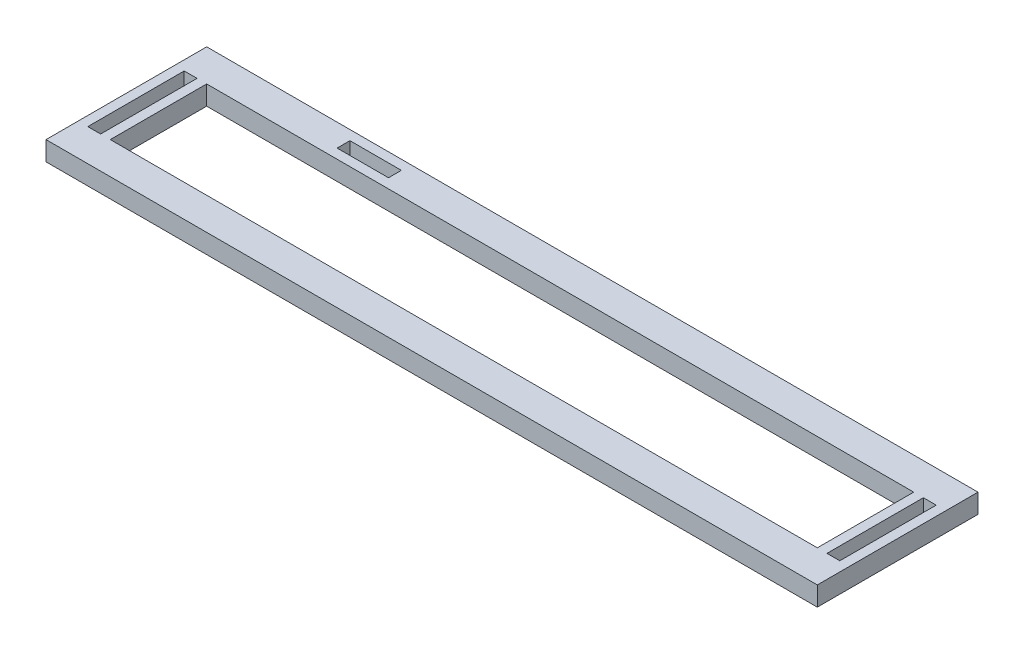
ISO-10303-21;
HEADER;
FILE_DESCRIPTION(('STEP AP214'),'2;1');
FILE_NAME('part.step','',(''),(''),'','','');
FILE_SCHEMA(('AUTOMOTIVE_DESIGN { 1 0 10303 214 1 1 1 1 }'));
ENDSEC;
DATA;
#1=APPLICATION_CONTEXT('core data for automotive mechanical design processes');
#2=APPLICATION_PROTOCOL_DEFINITION('international standard','automotive_design',2000,#1);
#3=PRODUCT_CONTEXT('',#1,'mechanical');
#4=PRODUCT('Part','Part','',(#3));
#5=PRODUCT_RELATED_PRODUCT_CATEGORY('part','',(#4));
#6=PRODUCT_DEFINITION_FORMATION('','',#4);
#7=PRODUCT_DEFINITION_CONTEXT('part definition',#1,'design');
#8=PRODUCT_DEFINITION('design','',#6,#7);
#9=PRODUCT_DEFINITION_SHAPE('','',#8);
#10=(LENGTH_UNIT() NAMED_UNIT(*) SI_UNIT(.MILLI.,.METRE.));
#11=(NAMED_UNIT(*) PLANE_ANGLE_UNIT() SI_UNIT($,.RADIAN.));
#12=(NAMED_UNIT(*) SI_UNIT($,.STERADIAN.) SOLID_ANGLE_UNIT());
#13=UNCERTAINTY_MEASURE_WITH_UNIT(LENGTH_MEASURE(1.E-05),#10,'distance_accuracy_value','');
#14=(GEOMETRIC_REPRESENTATION_CONTEXT(3) GLOBAL_UNCERTAINTY_ASSIGNED_CONTEXT((#13)) GLOBAL_UNIT_ASSIGNED_CONTEXT((#10,
#11,#12)) REPRESENTATION_CONTEXT('',''));
#15=CARTESIAN_POINT('',(0.,0.,0.));
#16=DIRECTION('',(0.,0.,1.));
#17=DIRECTION('',(1.,0.,0.));
#18=AXIS2_PLACEMENT_3D('',#15,#16,#17);
#19=CARTESIAN_POINT('',(0.,3.,0.));
#20=DIRECTION('',(0.,-1.,0.));
#21=DIRECTION('',(0.,0.,-1.));
#22=AXIS2_PLACEMENT_3D('',#19,#20,#21);
#23=PLANE('',#22);
#24=DIRECTION('',(0.,0.,-1.));
#25=VECTOR('',#24,1.);
#26=CARTESIAN_POINT('',(118.5,3.,-20.0000000000001));
#27=LINE('',#26,#25);
#28=CARTESIAN_POINT('',(118.5,3.,-5.00000000000006));
#29=VERTEX_POINT('',#28);
#30=CARTESIAN_POINT('',(118.5,3.,-20.0000000000001));
#31=VERTEX_POINT('',#30);
#32=EDGE_CURVE('E206',#29,#31,#27,.T.);
#33=ORIENTED_EDGE('',*,*,#32,.F.);
#34=DIRECTION('',(1.,0.,0.));
#35=VECTOR('',#34,1.);
#36=CARTESIAN_POINT('',(118.5,3.,-5.00000000000006));
#37=LINE('',#36,#35);
#38=CARTESIAN_POINT('',(116.5,3.,-5.00000000000005));
#39=VERTEX_POINT('',#38);
#40=EDGE_CURVE('E214',#39,#29,#37,.T.);
#41=ORIENTED_EDGE('',*,*,#40,.F.);
#42=DIRECTION('',(0.,0.,1.));
#43=VECTOR('',#42,1.);
#44=CARTESIAN_POINT('',(116.5,3.,-20.0000000000001));
#45=LINE('',#44,#43);
#46=CARTESIAN_POINT('',(116.5,3.,-20.0000000000001));
#47=VERTEX_POINT('',#46);
#48=EDGE_CURVE('E211',#47,#39,#45,.T.);
#49=ORIENTED_EDGE('',*,*,#48,.F.);
#50=DIRECTION('',(-1.,0.,0.));
#51=VECTOR('',#50,1.);
#52=CARTESIAN_POINT('',(118.5,3.,-20.0000000000001));
#53=LINE('',#52,#51);
#54=EDGE_CURVE('E208',#31,#47,#53,.T.);
#55=ORIENTED_EDGE('',*,*,#54,.F.);
#56=EDGE_LOOP('',(#33,#41,#49,#55));
#57=FACE_BOUND('',#56,.T.);
#58=DIRECTION('',(0.,0.,1.));
#59=VECTOR('',#58,1.);
#60=CARTESIAN_POINT('',(5.,3.,-20.));
#61=LINE('',#60,#59);
#62=CARTESIAN_POINT('',(5.,3.,-20.));
#63=VERTEX_POINT('',#62);
#64=CARTESIAN_POINT('',(5.,3.,-5.));
#65=VERTEX_POINT('',#64);
#66=EDGE_CURVE('E268',#63,#65,#61,.T.);
#67=ORIENTED_EDGE('',*,*,#66,.F.);
#68=DIRECTION('',(-1.,0.,0.));
#69=VECTOR('',#68,1.);
#70=CARTESIAN_POINT('',(5.,3.,-20.));
#71=LINE('',#70,#69);
#72=CARTESIAN_POINT('',(115.,3.,-20.));
#73=VERTEX_POINT('',#72);
#74=EDGE_CURVE('E276',#73,#63,#71,.T.);
#75=ORIENTED_EDGE('',*,*,#74,.F.);
#76=DIRECTION('',(0.,0.,-1.));
#77=VECTOR('',#76,1.);
#78=CARTESIAN_POINT('',(115.,3.,-20.));
#79=LINE('',#78,#77);
#80=CARTESIAN_POINT('',(115.,3.,-5.));
#81=VERTEX_POINT('',#80);
#82=EDGE_CURVE('E273',#81,#73,#79,.T.);
#83=ORIENTED_EDGE('',*,*,#82,.F.);
#84=DIRECTION('',(1.,0.,0.));
#85=VECTOR('',#84,1.);
#86=CARTESIAN_POINT('',(5.,3.,-5.));
#87=LINE('',#86,#85);
#88=EDGE_CURVE('E270',#65,#81,#87,.T.);
#89=ORIENTED_EDGE('',*,*,#88,.F.);
#90=EDGE_LOOP('',(#67,#75,#83,#89));
#91=FACE_BOUND('',#90,.T.);
#92=DIRECTION('',(0.,0.,1.));
#93=VECTOR('',#92,1.);
#94=CARTESIAN_POINT('',(0.,3.,0.));
#95=LINE('',#94,#93);
#96=CARTESIAN_POINT('',(0.,3.,-25.));
#97=VERTEX_POINT('',#96);
#98=CARTESIAN_POINT('',(0.,3.,0.));
#99=VERTEX_POINT('',#98);
#100=EDGE_CURVE('E299',#97,#99,#95,.T.);
#101=ORIENTED_EDGE('',*,*,#100,.T.);
#102=DIRECTION('',(1.,0.,0.));
#103=VECTOR('',#102,1.);
#104=CARTESIAN_POINT('',(0.,3.,0.));
#105=LINE('',#104,#103);
#106=CARTESIAN_POINT('',(120.,3.,0.));
#107=VERTEX_POINT('',#106);
#108=EDGE_CURVE('E302',#99,#107,#105,.T.);
#109=ORIENTED_EDGE('',*,*,#108,.T.);
#110=DIRECTION('',(0.,0.,-1.));
#111=VECTOR('',#110,1.);
#112=CARTESIAN_POINT('',(120.,3.,0.));
#113=LINE('',#112,#111);
#114=CARTESIAN_POINT('',(120.,3.,-25.));
#115=VERTEX_POINT('',#114);
#116=EDGE_CURVE('E305',#107,#115,#113,.T.);
#117=ORIENTED_EDGE('',*,*,#116,.T.);
#118=DIRECTION('',(-1.,0.,0.));
#119=VECTOR('',#118,1.);
#120=CARTESIAN_POINT('',(0.,3.,-25.));
#121=LINE('',#120,#119);
#122=EDGE_CURVE('E307',#115,#97,#121,.T.);
#123=ORIENTED_EDGE('',*,*,#122,.T.);
#124=EDGE_LOOP('',(#101,#109,#117,#123));
#125=FACE_BOUND('',#124,.T.);
#126=DIRECTION('',(0.,0.,1.));
#127=VECTOR('',#126,1.);
#128=CARTESIAN_POINT('',(1.5,3.,-20.));
#129=LINE('',#128,#127);
#130=CARTESIAN_POINT('',(1.5,3.,-20.));
#131=VERTEX_POINT('',#130);
#132=CARTESIAN_POINT('',(1.5,3.,-5.));
#133=VERTEX_POINT('',#132);
#134=EDGE_CURVE('E237',#131,#133,#129,.T.);
#135=ORIENTED_EDGE('',*,*,#134,.F.);
#136=DIRECTION('',(-1.,0.,0.));
#137=VECTOR('',#136,1.);
#138=CARTESIAN_POINT('',(1.5,3.,-20.));
#139=LINE('',#138,#137);
#140=CARTESIAN_POINT('',(3.5,3.,-20.));
#141=VERTEX_POINT('',#140);
#142=EDGE_CURVE('E245',#141,#131,#139,.T.);
#143=ORIENTED_EDGE('',*,*,#142,.F.);
#144=DIRECTION('',(0.,0.,-1.));
#145=VECTOR('',#144,1.);
#146=CARTESIAN_POINT('',(3.5,3.,-20.));
#147=LINE('',#146,#145);
#148=CARTESIAN_POINT('',(3.5,3.,-5.));
#149=VERTEX_POINT('',#148);
#150=EDGE_CURVE('E242',#149,#141,#147,.T.);
#151=ORIENTED_EDGE('',*,*,#150,.F.);
#152=DIRECTION('',(1.,0.,0.));
#153=VECTOR('',#152,1.);
#154=CARTESIAN_POINT('',(1.5,3.,-5.));
#155=LINE('',#154,#153);
#156=EDGE_CURVE('E239',#133,#149,#155,.T.);
#157=ORIENTED_EDGE('',*,*,#156,.F.);
#158=EDGE_LOOP('',(#135,#143,#151,#157));
#159=FACE_BOUND('',#158,.T.);
#160=DIRECTION('',(0.,0.,1.));
#161=VECTOR('',#160,1.);
#162=CARTESIAN_POINT('',(23.7874784816157,3.,-23.5));
#163=LINE('',#162,#161);
#164=CARTESIAN_POINT('',(23.7874784816157,3.,-23.5));
#165=VERTEX_POINT('',#164);
#166=CARTESIAN_POINT('',(23.7874784816157,3.,-21.5));
#167=VERTEX_POINT('',#166);
#168=EDGE_CURVE('E170',#165,#167,#163,.T.);
#169=ORIENTED_EDGE('',*,*,#168,.F.);
#170=DIRECTION('',(-1.,0.,0.));
#171=VECTOR('',#170,1.);
#172=CARTESIAN_POINT('',(23.7874784816157,3.,-23.5));
#173=LINE('',#172,#171);
#174=CARTESIAN_POINT('',(31.7874784816157,3.,-23.5));
#175=VERTEX_POINT('',#174);
#176=EDGE_CURVE('E192',#175,#165,#173,.T.);
#177=ORIENTED_EDGE('',*,*,#176,.F.);
#178=DIRECTION('',(0.,0.,-1.));
#179=VECTOR('',#178,1.);
#180=CARTESIAN_POINT('',(31.7874784816157,3.,-23.5));
#181=LINE('',#180,#179);
#182=CARTESIAN_POINT('',(31.7874784816157,3.,-21.5));
#183=VERTEX_POINT('',#182);
#184=EDGE_CURVE('E190',#183,#175,#181,.T.);
#185=ORIENTED_EDGE('',*,*,#184,.F.);
#186=DIRECTION('',(1.,0.,0.));
#187=VECTOR('',#186,1.);
#188=CARTESIAN_POINT('',(23.7874784816157,3.,-21.5));
#189=LINE('',#188,#187);
#190=EDGE_CURVE('E178',#167,#183,#189,.T.);
#191=ORIENTED_EDGE('',*,*,#190,.F.);
#192=EDGE_LOOP('',(#169,#177,#185,#191));
#193=FACE_BOUND('',#192,.T.);
#194=ADVANCED_FACE('F33',(#57,#91,#125,#159,#193),#23,.F.);
#195=CARTESIAN_POINT('',(0.,0.,0.));
#196=DIRECTION('',(0.,-1.,0.));
#197=DIRECTION('',(0.,0.,-1.));
#198=AXIS2_PLACEMENT_3D('',#195,#196,#197);
#199=PLANE('',#198);
#200=DIRECTION('',(0.,0.,1.));
#201=VECTOR('',#200,1.);
#202=CARTESIAN_POINT('',(0.,0.,0.));
#203=LINE('',#202,#201);
#204=CARTESIAN_POINT('',(0.,0.,-25.));
#205=VERTEX_POINT('',#204);
#206=CARTESIAN_POINT('',(0.,0.,0.));
#207=VERTEX_POINT('',#206);
#208=EDGE_CURVE('E298',#205,#207,#203,.T.);
#209=ORIENTED_EDGE('',*,*,#208,.F.);
#210=DIRECTION('',(-1.,0.,0.));
#211=VECTOR('',#210,1.);
#212=CARTESIAN_POINT('',(0.,0.,-25.));
#213=LINE('',#212,#211);
#214=CARTESIAN_POINT('',(120.,0.,-25.));
#215=VERTEX_POINT('',#214);
#216=EDGE_CURVE('E303',#215,#205,#213,.T.);
#217=ORIENTED_EDGE('',*,*,#216,.F.);
#218=DIRECTION('',(0.,0.,-1.));
#219=VECTOR('',#218,1.);
#220=CARTESIAN_POINT('',(120.,0.,0.));
#221=LINE('',#220,#219);
#222=CARTESIAN_POINT('',(120.,0.,0.));
#223=VERTEX_POINT('',#222);
#224=EDGE_CURVE('E314',#223,#215,#221,.T.);
#225=ORIENTED_EDGE('',*,*,#224,.F.);
#226=DIRECTION('',(1.,0.,0.));
#227=VECTOR('',#226,1.);
#228=CARTESIAN_POINT('',(0.,0.,0.));
#229=LINE('',#228,#227);
#230=EDGE_CURVE('E312',#207,#223,#229,.T.);
#231=ORIENTED_EDGE('',*,*,#230,.F.);
#232=EDGE_LOOP('',(#209,#217,#225,#231));
#233=FACE_BOUND('',#232,.T.);
#234=DIRECTION('',(-1.,0.,0.));
#235=VECTOR('',#234,1.);
#236=CARTESIAN_POINT('',(5.,0.,-20.));
#237=LINE('',#236,#235);
#238=CARTESIAN_POINT('',(115.,0.,-20.));
#239=VERTEX_POINT('',#238);
#240=CARTESIAN_POINT('',(5.,0.,-20.));
#241=VERTEX_POINT('',#240);
#242=EDGE_CURVE('E271',#239,#241,#237,.T.);
#243=ORIENTED_EDGE('',*,*,#242,.T.);
#244=DIRECTION('',(0.,0.,1.));
#245=VECTOR('',#244,1.);
#246=CARTESIAN_POINT('',(5.,0.,-20.));
#247=LINE('',#246,#245);
#248=CARTESIAN_POINT('',(5.,0.,-5.));
#249=VERTEX_POINT('',#248);
#250=EDGE_CURVE('E267',#241,#249,#247,.T.);
#251=ORIENTED_EDGE('',*,*,#250,.T.);
#252=DIRECTION('',(1.,0.,0.));
#253=VECTOR('',#252,1.);
#254=CARTESIAN_POINT('',(5.,0.,-5.));
#255=LINE('',#254,#253);
#256=CARTESIAN_POINT('',(115.,0.,-5.));
#257=VERTEX_POINT('',#256);
#258=EDGE_CURVE('E281',#249,#257,#255,.T.);
#259=ORIENTED_EDGE('',*,*,#258,.T.);
#260=DIRECTION('',(0.,0.,-1.));
#261=VECTOR('',#260,1.);
#262=CARTESIAN_POINT('',(115.,0.,-20.));
#263=LINE('',#262,#261);
#264=EDGE_CURVE('E284',#257,#239,#263,.T.);
#265=ORIENTED_EDGE('',*,*,#264,.T.);
#266=EDGE_LOOP('',(#243,#251,#259,#265));
#267=FACE_BOUND('',#266,.T.);
#268=DIRECTION('',(-1.,0.,0.));
#269=VECTOR('',#268,1.);
#270=CARTESIAN_POINT('',(1.5,0.,-20.));
#271=LINE('',#270,#269);
#272=CARTESIAN_POINT('',(3.5,0.,-20.));
#273=VERTEX_POINT('',#272);
#274=CARTESIAN_POINT('',(1.5,0.,-20.));
#275=VERTEX_POINT('',#274);
#276=EDGE_CURVE('E240',#273,#275,#271,.T.);
#277=ORIENTED_EDGE('',*,*,#276,.T.);
#278=DIRECTION('',(0.,0.,1.));
#279=VECTOR('',#278,1.);
#280=CARTESIAN_POINT('',(1.5,0.,-20.));
#281=LINE('',#280,#279);
#282=CARTESIAN_POINT('',(1.5,0.,-5.));
#283=VERTEX_POINT('',#282);
#284=EDGE_CURVE('E236',#275,#283,#281,.T.);
#285=ORIENTED_EDGE('',*,*,#284,.T.);
#286=DIRECTION('',(1.,0.,0.));
#287=VECTOR('',#286,1.);
#288=CARTESIAN_POINT('',(1.5,0.,-5.));
#289=LINE('',#288,#287);
#290=CARTESIAN_POINT('',(3.5,0.,-5.));
#291=VERTEX_POINT('',#290);
#292=EDGE_CURVE('E250',#283,#291,#289,.T.);
#293=ORIENTED_EDGE('',*,*,#292,.T.);
#294=DIRECTION('',(0.,0.,-1.));
#295=VECTOR('',#294,1.);
#296=CARTESIAN_POINT('',(3.5,0.,-20.));
#297=LINE('',#296,#295);
#298=EDGE_CURVE('E253',#291,#273,#297,.T.);
#299=ORIENTED_EDGE('',*,*,#298,.T.);
#300=EDGE_LOOP('',(#277,#285,#293,#299));
#301=FACE_BOUND('',#300,.T.);
#302=DIRECTION('',(1.,0.,0.));
#303=VECTOR('',#302,1.);
#304=CARTESIAN_POINT('',(118.5,0.,-5.00000000000006));
#305=LINE('',#304,#303);
#306=CARTESIAN_POINT('',(116.5,0.,-5.00000000000005));
#307=VERTEX_POINT('',#306);
#308=CARTESIAN_POINT('',(118.5,0.,-5.00000000000006));
#309=VERTEX_POINT('',#308);
#310=EDGE_CURVE('E209',#307,#309,#305,.T.);
#311=ORIENTED_EDGE('',*,*,#310,.T.);
#312=DIRECTION('',(0.,0.,-1.));
#313=VECTOR('',#312,1.);
#314=CARTESIAN_POINT('',(118.5,0.,-20.0000000000001));
#315=LINE('',#314,#313);
#316=CARTESIAN_POINT('',(118.5,0.,-20.0000000000001));
#317=VERTEX_POINT('',#316);
#318=EDGE_CURVE('E186',#309,#317,#315,.T.);
#319=ORIENTED_EDGE('',*,*,#318,.T.);
#320=DIRECTION('',(-1.,0.,0.));
#321=VECTOR('',#320,1.);
#322=CARTESIAN_POINT('',(118.5,0.,-20.0000000000001));
#323=LINE('',#322,#321);
#324=CARTESIAN_POINT('',(116.5,0.,-20.0000000000001));
#325=VERTEX_POINT('',#324);
#326=EDGE_CURVE('E219',#317,#325,#323,.T.);
#327=ORIENTED_EDGE('',*,*,#326,.T.);
#328=DIRECTION('',(0.,0.,1.));
#329=VECTOR('',#328,1.);
#330=CARTESIAN_POINT('',(116.5,0.,-20.0000000000001));
#331=LINE('',#330,#329);
#332=EDGE_CURVE('E222',#325,#307,#331,.T.);
#333=ORIENTED_EDGE('',*,*,#332,.T.);
#334=EDGE_LOOP('',(#311,#319,#327,#333));
#335=FACE_BOUND('',#334,.T.);
#336=DIRECTION('',(-1.,0.,0.));
#337=VECTOR('',#336,1.);
#338=CARTESIAN_POINT('',(23.7874784816157,0.,-23.5));
#339=LINE('',#338,#337);
#340=CARTESIAN_POINT('',(31.7874784816157,0.,-23.5));
#341=VERTEX_POINT('',#340);
#342=CARTESIAN_POINT('',(23.7874784816157,0.,-23.5));
#343=VERTEX_POINT('',#342);
#344=EDGE_CURVE('E179',#341,#343,#339,.T.);
#345=ORIENTED_EDGE('',*,*,#344,.T.);
#346=DIRECTION('',(0.,0.,1.));
#347=VECTOR('',#346,1.);
#348=CARTESIAN_POINT('',(23.7874784816157,0.,-23.5));
#349=LINE('',#348,#347);
#350=CARTESIAN_POINT('',(23.7874784816157,0.,-21.5));
#351=VERTEX_POINT('',#350);
#352=EDGE_CURVE('E56',#343,#351,#349,.T.);
#353=ORIENTED_EDGE('',*,*,#352,.T.);
#354=DIRECTION('',(1.,0.,0.));
#355=VECTOR('',#354,1.);
#356=CARTESIAN_POINT('',(23.7874784816157,0.,-21.5));
#357=LINE('',#356,#355);
#358=CARTESIAN_POINT('',(31.7874784816157,0.,-21.5));
#359=VERTEX_POINT('',#358);
#360=EDGE_CURVE('E185',#351,#359,#357,.T.);
#361=ORIENTED_EDGE('',*,*,#360,.T.);
#362=DIRECTION('',(0.,0.,-1.));
#363=VECTOR('',#362,1.);
#364=CARTESIAN_POINT('',(31.7874784816157,0.,-23.5));
#365=LINE('',#364,#363);
#366=EDGE_CURVE('E198',#359,#341,#365,.T.);
#367=ORIENTED_EDGE('',*,*,#366,.T.);
#368=EDGE_LOOP('',(#345,#353,#361,#367));
#369=FACE_BOUND('',#368,.T.);
#370=ADVANCED_FACE('F332',(#233,#267,#301,#335,#369),#199,.T.);
#371=CARTESIAN_POINT('',(0.,3.,0.));
#372=DIRECTION('',(1.,0.,0.));
#373=DIRECTION('',(0.,0.,-1.));
#374=AXIS2_PLACEMENT_3D('',#371,#372,#373);
#375=PLANE('',#374);
#376=ORIENTED_EDGE('',*,*,#208,.T.);
#377=DIRECTION('',(0.,-1.,0.));
#378=VECTOR('',#377,1.);
#379=CARTESIAN_POINT('',(0.,3.,0.));
#380=LINE('',#379,#378);
#381=EDGE_CURVE('E11',#99,#207,#380,.T.);
#382=ORIENTED_EDGE('',*,*,#381,.F.);
#383=ORIENTED_EDGE('',*,*,#100,.F.);
#384=DIRECTION('',(0.,-1.,0.));
#385=VECTOR('',#384,1.);
#386=CARTESIAN_POINT('',(0.,3.,-25.));
#387=LINE('',#386,#385);
#388=EDGE_CURVE('E309',#97,#205,#387,.T.);
#389=ORIENTED_EDGE('',*,*,#388,.T.);
#390=EDGE_LOOP('',(#376,#382,#383,#389));
#391=FACE_BOUND('',#390,.T.);
#392=ADVANCED_FACE('F35',(#391),#375,.F.);
#393=CARTESIAN_POINT('',(0.,3.,0.));
#394=DIRECTION('',(0.,0.,-1.));
#395=DIRECTION('',(-1.,0.,0.));
#396=AXIS2_PLACEMENT_3D('',#393,#394,#395);
#397=PLANE('',#396);
#398=ORIENTED_EDGE('',*,*,#230,.T.);
#399=DIRECTION('',(0.,-1.,0.));
#400=VECTOR('',#399,1.);
#401=CARTESIAN_POINT('',(120.,3.,0.));
#402=LINE('',#401,#400);
#403=EDGE_CURVE('E41',#107,#223,#402,.T.);
#404=ORIENTED_EDGE('',*,*,#403,.F.);
#405=ORIENTED_EDGE('',*,*,#108,.F.);
#406=ORIENTED_EDGE('',*,*,#381,.T.);
#407=EDGE_LOOP('',(#398,#404,#405,#406));
#408=FACE_BOUND('',#407,.T.);
#409=ADVANCED_FACE('F343',(#408),#397,.F.);
#410=CARTESIAN_POINT('',(120.,3.,0.));
#411=DIRECTION('',(-1.,0.,0.));
#412=DIRECTION('',(0.,0.,1.));
#413=AXIS2_PLACEMENT_3D('',#410,#411,#412);
#414=PLANE('',#413);
#415=ORIENTED_EDGE('',*,*,#224,.T.);
#416=DIRECTION('',(0.,-1.,0.));
#417=VECTOR('',#416,1.);
#418=CARTESIAN_POINT('',(120.,3.,-25.));
#419=LINE('',#418,#417);
#420=EDGE_CURVE('E319',#115,#215,#419,.T.);
#421=ORIENTED_EDGE('',*,*,#420,.F.);
#422=ORIENTED_EDGE('',*,*,#116,.F.);
#423=ORIENTED_EDGE('',*,*,#403,.T.);
#424=EDGE_LOOP('',(#415,#421,#422,#423));
#425=FACE_BOUND('',#424,.T.);
#426=ADVANCED_FACE('F326',(#425),#414,.F.);
#427=CARTESIAN_POINT('',(0.,3.,-25.));
#428=DIRECTION('',(0.,0.,1.));
#429=DIRECTION('',(1.,0.,0.));
#430=AXIS2_PLACEMENT_3D('',#427,#428,#429);
#431=PLANE('',#430);
#432=ORIENTED_EDGE('',*,*,#216,.T.);
#433=ORIENTED_EDGE('',*,*,#388,.F.);
#434=ORIENTED_EDGE('',*,*,#122,.F.);
#435=ORIENTED_EDGE('',*,*,#420,.T.);
#436=EDGE_LOOP('',(#432,#433,#434,#435));
#437=FACE_BOUND('',#436,.T.);
#438=ADVANCED_FACE('F336',(#437),#431,.F.);
#439=CARTESIAN_POINT('',(5.,3.,-20.));
#440=DIRECTION('',(1.,0.,0.));
#441=DIRECTION('',(0.,0.,-1.));
#442=AXIS2_PLACEMENT_3D('',#439,#440,#441);
#443=PLANE('',#442);
#444=ORIENTED_EDGE('',*,*,#250,.F.);
#445=DIRECTION('',(0.,-1.,0.));
#446=VECTOR('',#445,1.);
#447=CARTESIAN_POINT('',(5.,3.,-20.));
#448=LINE('',#447,#446);
#449=EDGE_CURVE('E278',#63,#241,#448,.T.);
#450=ORIENTED_EDGE('',*,*,#449,.F.);
#451=ORIENTED_EDGE('',*,*,#66,.T.);
#452=DIRECTION('',(0.,-1.,0.));
#453=VECTOR('',#452,1.);
#454=CARTESIAN_POINT('',(5.,3.,-5.));
#455=LINE('',#454,#453);
#456=EDGE_CURVE('E295',#65,#249,#455,.T.);
#457=ORIENTED_EDGE('',*,*,#456,.T.);
#458=EDGE_LOOP('',(#444,#450,#451,#457));
#459=FACE_BOUND('',#458,.T.);
#460=ADVANCED_FACE('F360',(#459),#443,.T.);
#461=CARTESIAN_POINT('',(5.,3.,-5.));
#462=DIRECTION('',(0.,0.,-1.));
#463=DIRECTION('',(-1.,0.,0.));
#464=AXIS2_PLACEMENT_3D('',#461,#462,#463);
#465=PLANE('',#464);
#466=ORIENTED_EDGE('',*,*,#258,.F.);
#467=ORIENTED_EDGE('',*,*,#456,.F.);
#468=ORIENTED_EDGE('',*,*,#88,.T.);
#469=DIRECTION('',(0.,-1.,0.));
#470=VECTOR('',#469,1.);
#471=CARTESIAN_POINT('',(115.,3.,-5.));
#472=LINE('',#471,#470);
#473=EDGE_CURVE('E293',#81,#257,#472,.T.);
#474=ORIENTED_EDGE('',*,*,#473,.T.);
#475=EDGE_LOOP('',(#466,#467,#468,#474));
#476=FACE_BOUND('',#475,.T.);
#477=ADVANCED_FACE('F367',(#476),#465,.T.);
#478=CARTESIAN_POINT('',(115.,3.,-20.));
#479=DIRECTION('',(-1.,0.,0.));
#480=DIRECTION('',(0.,0.,1.));
#481=AXIS2_PLACEMENT_3D('',#478,#479,#480);
#482=PLANE('',#481);
#483=ORIENTED_EDGE('',*,*,#264,.F.);
#484=ORIENTED_EDGE('',*,*,#473,.F.);
#485=ORIENTED_EDGE('',*,*,#82,.T.);
#486=DIRECTION('',(0.,-1.,0.));
#487=VECTOR('',#486,1.);
#488=CARTESIAN_POINT('',(115.,3.,-20.));
#489=LINE('',#488,#487);
#490=EDGE_CURVE('E291',#73,#239,#489,.T.);
#491=ORIENTED_EDGE('',*,*,#490,.T.);
#492=EDGE_LOOP('',(#483,#484,#485,#491));
#493=FACE_BOUND('',#492,.T.);
#494=ADVANCED_FACE('F372',(#493),#482,.T.);
#495=CARTESIAN_POINT('',(5.,3.,-20.));
#496=DIRECTION('',(0.,0.,1.));
#497=DIRECTION('',(1.,0.,0.));
#498=AXIS2_PLACEMENT_3D('',#495,#496,#497);
#499=PLANE('',#498);
#500=ORIENTED_EDGE('',*,*,#242,.F.);
#501=ORIENTED_EDGE('',*,*,#490,.F.);
#502=ORIENTED_EDGE('',*,*,#74,.T.);
#503=ORIENTED_EDGE('',*,*,#449,.T.);
#504=EDGE_LOOP('',(#500,#501,#502,#503));
#505=FACE_BOUND('',#504,.T.);
#506=ADVANCED_FACE('F379',(#505),#499,.T.);
#507=CARTESIAN_POINT('',(1.5,3.,-20.));
#508=DIRECTION('',(1.,0.,0.));
#509=DIRECTION('',(0.,0.,-1.));
#510=AXIS2_PLACEMENT_3D('',#507,#508,#509);
#511=PLANE('',#510);
#512=ORIENTED_EDGE('',*,*,#284,.F.);
#513=DIRECTION('',(0.,-1.,0.));
#514=VECTOR('',#513,1.);
#515=CARTESIAN_POINT('',(1.5,3.,-20.));
#516=LINE('',#515,#514);
#517=EDGE_CURVE('E247',#131,#275,#516,.T.);
#518=ORIENTED_EDGE('',*,*,#517,.F.);
#519=ORIENTED_EDGE('',*,*,#134,.T.);
#520=DIRECTION('',(0.,-1.,0.));
#521=VECTOR('',#520,1.);
#522=CARTESIAN_POINT('',(1.5,3.,-5.));
#523=LINE('',#522,#521);
#524=EDGE_CURVE('E264',#133,#283,#523,.T.);
#525=ORIENTED_EDGE('',*,*,#524,.T.);
#526=EDGE_LOOP('',(#512,#518,#519,#525));
#527=FACE_BOUND('',#526,.T.);
#528=ADVANCED_FACE('F392',(#527),#511,.T.);
#529=CARTESIAN_POINT('',(1.5,3.,-5.));
#530=DIRECTION('',(0.,0.,-1.));
#531=DIRECTION('',(-1.,0.,0.));
#532=AXIS2_PLACEMENT_3D('',#529,#530,#531);
#533=PLANE('',#532);
#534=ORIENTED_EDGE('',*,*,#292,.F.);
#535=ORIENTED_EDGE('',*,*,#524,.F.);
#536=ORIENTED_EDGE('',*,*,#156,.T.);
#537=DIRECTION('',(0.,-1.,0.));
#538=VECTOR('',#537,1.);
#539=CARTESIAN_POINT('',(3.5,3.,-5.));
#540=LINE('',#539,#538);
#541=EDGE_CURVE('E262',#149,#291,#540,.T.);
#542=ORIENTED_EDGE('',*,*,#541,.T.);
#543=EDGE_LOOP('',(#534,#535,#536,#542));
#544=FACE_BOUND('',#543,.T.);
#545=ADVANCED_FACE('F397',(#544),#533,.T.);
#546=CARTESIAN_POINT('',(3.5,3.,-20.));
#547=DIRECTION('',(-1.,0.,0.));
#548=DIRECTION('',(0.,0.,1.));
#549=AXIS2_PLACEMENT_3D('',#546,#547,#548);
#550=PLANE('',#549);
#551=ORIENTED_EDGE('',*,*,#298,.F.);
#552=ORIENTED_EDGE('',*,*,#541,.F.);
#553=ORIENTED_EDGE('',*,*,#150,.T.);
#554=DIRECTION('',(0.,-1.,0.));
#555=VECTOR('',#554,1.);
#556=CARTESIAN_POINT('',(3.5,3.,-20.));
#557=LINE('',#556,#555);
#558=EDGE_CURVE('E260',#141,#273,#557,.T.);
#559=ORIENTED_EDGE('',*,*,#558,.T.);
#560=EDGE_LOOP('',(#551,#552,#553,#559));
#561=FACE_BOUND('',#560,.T.);
#562=ADVANCED_FACE('F401',(#561),#550,.T.);
#563=CARTESIAN_POINT('',(1.5,3.,-20.));
#564=DIRECTION('',(0.,0.,1.));
#565=DIRECTION('',(1.,0.,0.));
#566=AXIS2_PLACEMENT_3D('',#563,#564,#565);
#567=PLANE('',#566);
#568=ORIENTED_EDGE('',*,*,#276,.F.);
#569=ORIENTED_EDGE('',*,*,#558,.F.);
#570=ORIENTED_EDGE('',*,*,#142,.T.);
#571=ORIENTED_EDGE('',*,*,#517,.T.);
#572=EDGE_LOOP('',(#568,#569,#570,#571));
#573=FACE_BOUND('',#572,.T.);
#574=ADVANCED_FACE('F405',(#573),#567,.T.);
#575=CARTESIAN_POINT('',(118.5,3.,-20.0000000000001));
#576=DIRECTION('',(-1.,0.,0.));
#577=DIRECTION('',(0.,0.,1.));
#578=AXIS2_PLACEMENT_3D('',#575,#576,#577);
#579=PLANE('',#578);
#580=ORIENTED_EDGE('',*,*,#318,.F.);
#581=DIRECTION('',(0.,-1.,0.));
#582=VECTOR('',#581,1.);
#583=CARTESIAN_POINT('',(118.5,3.,-5.00000000000006));
#584=LINE('',#583,#582);
#585=EDGE_CURVE('E216',#29,#309,#584,.T.);
#586=ORIENTED_EDGE('',*,*,#585,.F.);
#587=ORIENTED_EDGE('',*,*,#32,.T.);
#588=DIRECTION('',(0.,-1.,0.));
#589=VECTOR('',#588,1.);
#590=CARTESIAN_POINT('',(118.5,3.,-20.0000000000001));
#591=LINE('',#590,#589);
#592=EDGE_CURVE('E233',#31,#317,#591,.T.);
#593=ORIENTED_EDGE('',*,*,#592,.T.);
#594=EDGE_LOOP('',(#580,#586,#587,#593));
#595=FACE_BOUND('',#594,.T.);
#596=ADVANCED_FACE('F409',(#595),#579,.T.);
#597=CARTESIAN_POINT('',(118.5,3.,-20.0000000000001));
#598=DIRECTION('',(0.,0.,1.));
#599=DIRECTION('',(1.,0.,0.));
#600=AXIS2_PLACEMENT_3D('',#597,#598,#599);
#601=PLANE('',#600);
#602=ORIENTED_EDGE('',*,*,#326,.F.);
#603=ORIENTED_EDGE('',*,*,#592,.F.);
#604=ORIENTED_EDGE('',*,*,#54,.T.);
#605=DIRECTION('',(0.,-1.,0.));
#606=VECTOR('',#605,1.);
#607=CARTESIAN_POINT('',(116.5,3.,-20.0000000000001));
#608=LINE('',#607,#606);
#609=EDGE_CURVE('E231',#47,#325,#608,.T.);
#610=ORIENTED_EDGE('',*,*,#609,.T.);
#611=EDGE_LOOP('',(#602,#603,#604,#610));
#612=FACE_BOUND('',#611,.T.);
#613=ADVANCED_FACE('F413',(#612),#601,.T.);
#614=CARTESIAN_POINT('',(116.5,3.,-20.0000000000001));
#615=DIRECTION('',(1.,0.,0.));
#616=DIRECTION('',(0.,0.,-1.));
#617=AXIS2_PLACEMENT_3D('',#614,#615,#616);
#618=PLANE('',#617);
#619=ORIENTED_EDGE('',*,*,#332,.F.);
#620=ORIENTED_EDGE('',*,*,#609,.F.);
#621=ORIENTED_EDGE('',*,*,#48,.T.);
#622=DIRECTION('',(0.,-1.,0.));
#623=VECTOR('',#622,1.);
#624=CARTESIAN_POINT('',(116.5,3.,-5.00000000000005));
#625=LINE('',#624,#623);
#626=EDGE_CURVE('E229',#39,#307,#625,.T.);
#627=ORIENTED_EDGE('',*,*,#626,.T.);
#628=EDGE_LOOP('',(#619,#620,#621,#627));
#629=FACE_BOUND('',#628,.T.);
#630=ADVANCED_FACE('F417',(#629),#618,.T.);
#631=CARTESIAN_POINT('',(118.5,3.,-5.00000000000006));
#632=DIRECTION('',(0.,0.,-1.));
#633=DIRECTION('',(-1.,0.,0.));
#634=AXIS2_PLACEMENT_3D('',#631,#632,#633);
#635=PLANE('',#634);
#636=ORIENTED_EDGE('',*,*,#310,.F.);
#637=ORIENTED_EDGE('',*,*,#626,.F.);
#638=ORIENTED_EDGE('',*,*,#40,.T.);
#639=ORIENTED_EDGE('',*,*,#585,.T.);
#640=EDGE_LOOP('',(#636,#637,#638,#639));
#641=FACE_BOUND('',#640,.T.);
#642=ADVANCED_FACE('F421',(#641),#635,.T.);
#643=CARTESIAN_POINT('',(23.7874784816157,3.,-23.5));
#644=DIRECTION('',(1.,0.,0.));
#645=DIRECTION('',(0.,0.,-1.));
#646=AXIS2_PLACEMENT_3D('',#643,#644,#645);
#647=PLANE('',#646);
#648=ORIENTED_EDGE('',*,*,#352,.F.);
#649=DIRECTION('',(0.,-1.,0.));
#650=VECTOR('',#649,1.);
#651=CARTESIAN_POINT('',(23.7874784816157,3.,-23.5));
#652=LINE('',#651,#650);
#653=EDGE_CURVE('E174',#165,#343,#652,.T.);
#654=ORIENTED_EDGE('',*,*,#653,.F.);
#655=ORIENTED_EDGE('',*,*,#168,.T.);
#656=DIRECTION('',(0.,-1.,0.));
#657=VECTOR('',#656,1.);
#658=CARTESIAN_POINT('',(23.7874784816157,3.,-21.5));
#659=LINE('',#658,#657);
#660=EDGE_CURVE('E173',#167,#351,#659,.T.);
#661=ORIENTED_EDGE('',*,*,#660,.T.);
#662=EDGE_LOOP('',(#648,#654,#655,#661));
#663=FACE_BOUND('',#662,.T.);
#664=ADVANCED_FACE('F172',(#663),#647,.T.);
#665=CARTESIAN_POINT('',(23.7874784816157,3.,-21.5));
#666=DIRECTION('',(0.,0.,-1.));
#667=DIRECTION('',(-1.,0.,0.));
#668=AXIS2_PLACEMENT_3D('',#665,#666,#667);
#669=PLANE('',#668);
#670=ORIENTED_EDGE('',*,*,#360,.F.);
#671=ORIENTED_EDGE('',*,*,#660,.F.);
#672=ORIENTED_EDGE('',*,*,#190,.T.);
#673=DIRECTION('',(0.,-1.,0.));
#674=VECTOR('',#673,1.);
#675=CARTESIAN_POINT('',(31.7874784816157,3.,-21.5));
#676=LINE('',#675,#674);
#677=EDGE_CURVE('E187',#183,#359,#676,.T.);
#678=ORIENTED_EDGE('',*,*,#677,.T.);
#679=EDGE_LOOP('',(#670,#671,#672,#678));
#680=FACE_BOUND('',#679,.T.);
#681=ADVANCED_FACE('F182',(#680),#669,.T.);
#682=CARTESIAN_POINT('',(31.7874784816157,3.,-23.5));
#683=DIRECTION('',(-1.,0.,0.));
#684=DIRECTION('',(0.,0.,1.));
#685=AXIS2_PLACEMENT_3D('',#682,#683,#684);
#686=PLANE('',#685);
#687=ORIENTED_EDGE('',*,*,#366,.F.);
#688=ORIENTED_EDGE('',*,*,#677,.F.);
#689=ORIENTED_EDGE('',*,*,#184,.T.);
#690=DIRECTION('',(0.,-1.,0.));
#691=VECTOR('',#690,1.);
#692=CARTESIAN_POINT('',(31.7874784816157,3.,-23.5));
#693=LINE('',#692,#691);
#694=EDGE_CURVE('E48',#175,#341,#693,.T.);
#695=ORIENTED_EDGE('',*,*,#694,.T.);
#696=EDGE_LOOP('',(#687,#688,#689,#695));
#697=FACE_BOUND('',#696,.T.);
#698=ADVANCED_FACE('F430',(#697),#686,.T.);
#699=CARTESIAN_POINT('',(23.7874784816157,3.,-23.5));
#700=DIRECTION('',(0.,0.,1.));
#701=DIRECTION('',(1.,0.,0.));
#702=AXIS2_PLACEMENT_3D('',#699,#700,#701);
#703=PLANE('',#702);
#704=ORIENTED_EDGE('',*,*,#344,.F.);
#705=ORIENTED_EDGE('',*,*,#694,.F.);
#706=ORIENTED_EDGE('',*,*,#176,.T.);
#707=ORIENTED_EDGE('',*,*,#653,.T.);
#708=EDGE_LOOP('',(#704,#705,#706,#707));
#709=FACE_BOUND('',#708,.T.);
#710=ADVANCED_FACE('F433',(#709),#703,.T.);
#711=CLOSED_SHELL('',(#194,#370,#392,#409,#426,#438,#460,#477,#494,#506,#528,#545,#562,#574,
#596,#613,#630,#642,#664,#681,#698,#710));
#712=MANIFOLD_SOLID_BREP('B2',#711);
#713=ADVANCED_BREP_SHAPE_REPRESENTATION('',(#18,#712),#14);
#714=SHAPE_DEFINITION_REPRESENTATION(#9,#713);
ENDSEC;
END-ISO-10303-21;
